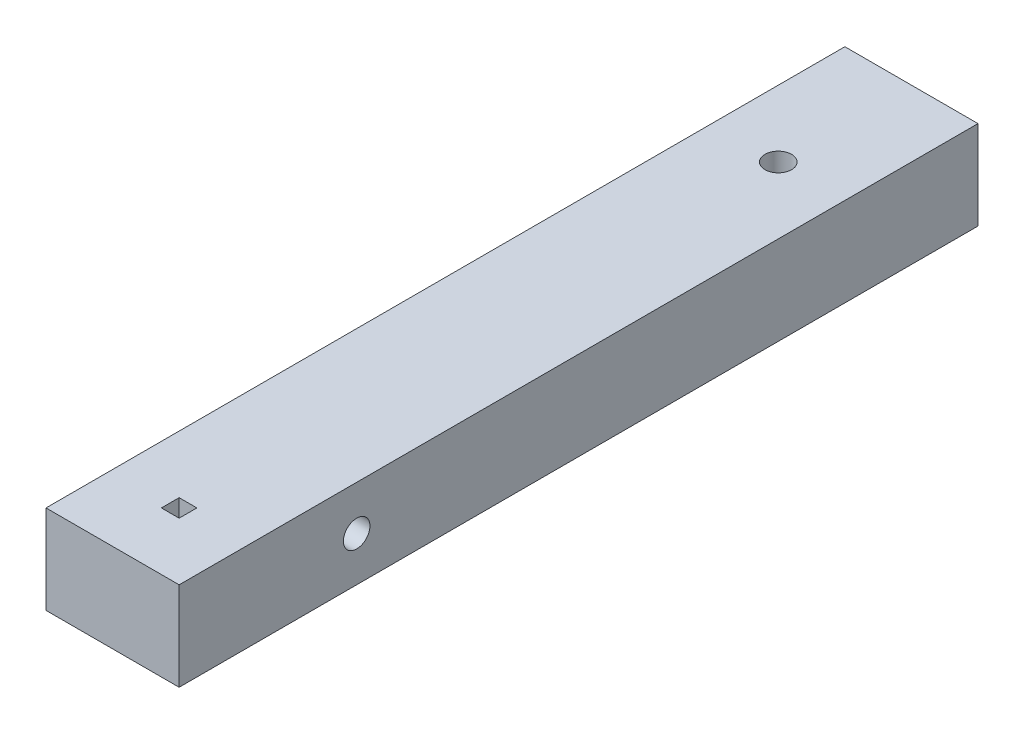
ISO-10303-21;
HEADER;
FILE_DESCRIPTION(('STEP AP214'),'2;1');
FILE_NAME('part.step','',(''),(''),'','','');
FILE_SCHEMA(('AUTOMOTIVE_DESIGN { 1 0 10303 214 1 1 1 1 }'));
ENDSEC;
DATA;
#1=APPLICATION_CONTEXT('core data for automotive mechanical design processes');
#2=APPLICATION_PROTOCOL_DEFINITION('international standard','automotive_design',2000,#1);
#3=PRODUCT_CONTEXT('',#1,'mechanical');
#4=PRODUCT('Part','Part','',(#3));
#5=PRODUCT_RELATED_PRODUCT_CATEGORY('part','',(#4));
#6=PRODUCT_DEFINITION_FORMATION('','',#4);
#7=PRODUCT_DEFINITION_CONTEXT('part definition',#1,'design');
#8=PRODUCT_DEFINITION('design','',#6,#7);
#9=PRODUCT_DEFINITION_SHAPE('','',#8);
#10=(LENGTH_UNIT() NAMED_UNIT(*) SI_UNIT(.MILLI.,.METRE.));
#11=(NAMED_UNIT(*) PLANE_ANGLE_UNIT() SI_UNIT($,.RADIAN.));
#12=(NAMED_UNIT(*) SI_UNIT($,.STERADIAN.) SOLID_ANGLE_UNIT());
#13=UNCERTAINTY_MEASURE_WITH_UNIT(LENGTH_MEASURE(1.E-05),#10,'distance_accuracy_value','');
#14=(GEOMETRIC_REPRESENTATION_CONTEXT(3) GLOBAL_UNCERTAINTY_ASSIGNED_CONTEXT((#13)) GLOBAL_UNIT_ASSIGNED_CONTEXT((#10,
#11,#12)) REPRESENTATION_CONTEXT('',''));
#15=CARTESIAN_POINT('',(0.,0.,0.));
#16=DIRECTION('',(0.,0.,1.));
#17=DIRECTION('',(1.,0.,0.));
#18=AXIS2_PLACEMENT_3D('',#15,#16,#17);
#19=CARTESIAN_POINT('',(-7.5,10.,45.));
#20=DIRECTION('',(1.,0.,0.));
#21=DIRECTION('',(0.,0.,-1.));
#22=AXIS2_PLACEMENT_3D('',#19,#20,#21);
#23=PLANE('',#22);
#24=CARTESIAN_POINT('',(-7.5,5.,25.));
#25=DIRECTION('',(1.,0.,0.));
#26=DIRECTION('',(0.,0.,-1.));
#27=AXIS2_PLACEMENT_3D('',#24,#25,#26);
#28=CIRCLE('',#27,1.5);
#29=CARTESIAN_POINT('',(-7.5,5.,23.5));
#30=VERTEX_POINT('',#29);
#31=EDGE_CURVE('E186',#30,#30,#28,.T.);
#32=ORIENTED_EDGE('',*,*,#31,.T.);
#33=EDGE_LOOP('',(#32));
#34=FACE_BOUND('',#33,.T.);
#35=DIRECTION('',(0.,0.,1.));
#36=VECTOR('',#35,1.);
#37=CARTESIAN_POINT('',(-7.5,0.,45.));
#38=LINE('',#37,#36);
#39=CARTESIAN_POINT('',(-7.5,0.,-45.));
#40=VERTEX_POINT('',#39);
#41=CARTESIAN_POINT('',(-7.5,0.,45.));
#42=VERTEX_POINT('',#41);
#43=EDGE_CURVE('E189',#40,#42,#38,.T.);
#44=ORIENTED_EDGE('',*,*,#43,.T.);
#45=DIRECTION('',(0.,-1.,0.));
#46=VECTOR('',#45,1.);
#47=CARTESIAN_POINT('',(-7.5,10.,45.));
#48=LINE('',#47,#46);
#49=CARTESIAN_POINT('',(-7.5,10.,45.));
#50=VERTEX_POINT('',#49);
#51=EDGE_CURVE('E218',#50,#42,#48,.T.);
#52=ORIENTED_EDGE('',*,*,#51,.F.);
#53=DIRECTION('',(0.,0.,1.));
#54=VECTOR('',#53,1.);
#55=CARTESIAN_POINT('',(-7.5,10.,45.));
#56=LINE('',#55,#54);
#57=CARTESIAN_POINT('',(-7.5,10.,-45.));
#58=VERTEX_POINT('',#57);
#59=EDGE_CURVE('E192',#58,#50,#56,.T.);
#60=ORIENTED_EDGE('',*,*,#59,.F.);
#61=DIRECTION('',(0.,-1.,0.));
#62=VECTOR('',#61,1.);
#63=CARTESIAN_POINT('',(-7.5,10.,-45.));
#64=LINE('',#63,#62);
#65=EDGE_CURVE('E202',#58,#40,#64,.T.);
#66=ORIENTED_EDGE('',*,*,#65,.T.);
#67=EDGE_LOOP('',(#44,#52,#60,#66));
#68=FACE_BOUND('',#67,.T.);
#69=ADVANCED_FACE('F31',(#34,#68),#23,.F.);
#70=CARTESIAN_POINT('',(7.5,10.,45.));
#71=DIRECTION('',(0.,0.,-1.));
#72=DIRECTION('',(-1.,0.,0.));
#73=AXIS2_PLACEMENT_3D('',#70,#71,#72);
#74=PLANE('',#73);
#75=DIRECTION('',(1.,0.,0.));
#76=VECTOR('',#75,1.);
#77=CARTESIAN_POINT('',(7.5,0.,45.));
#78=LINE('',#77,#76);
#79=CARTESIAN_POINT('',(7.5,0.,45.));
#80=VERTEX_POINT('',#79);
#81=EDGE_CURVE('E205',#42,#80,#78,.T.);
#82=ORIENTED_EDGE('',*,*,#81,.T.);
#83=DIRECTION('',(0.,-1.,0.));
#84=VECTOR('',#83,1.);
#85=CARTESIAN_POINT('',(7.5,10.,45.));
#86=LINE('',#85,#84);
#87=CARTESIAN_POINT('',(7.5,10.,45.));
#88=VERTEX_POINT('',#87);
#89=EDGE_CURVE('E215',#88,#80,#86,.T.);
#90=ORIENTED_EDGE('',*,*,#89,.F.);
#91=DIRECTION('',(1.,0.,0.));
#92=VECTOR('',#91,1.);
#93=CARTESIAN_POINT('',(7.5,10.,45.));
#94=LINE('',#93,#92);
#95=EDGE_CURVE('E195',#50,#88,#94,.T.);
#96=ORIENTED_EDGE('',*,*,#95,.F.);
#97=ORIENTED_EDGE('',*,*,#51,.T.);
#98=EDGE_LOOP('',(#82,#90,#96,#97));
#99=FACE_BOUND('',#98,.T.);
#100=ADVANCED_FACE('F242',(#99),#74,.F.);
#101=CARTESIAN_POINT('',(7.5,10.,45.));
#102=DIRECTION('',(-1.,0.,0.));
#103=DIRECTION('',(0.,0.,1.));
#104=AXIS2_PLACEMENT_3D('',#101,#102,#103);
#105=PLANE('',#104);
#106=CARTESIAN_POINT('',(7.5,5.,25.));
#107=DIRECTION('',(1.,0.,0.));
#108=DIRECTION('',(0.,0.,-1.));
#109=AXIS2_PLACEMENT_3D('',#106,#107,#108);
#110=CIRCLE('',#109,1.5);
#111=CARTESIAN_POINT('',(7.5,5.,23.5));
#112=VERTEX_POINT('',#111);
#113=EDGE_CURVE('E179',#112,#112,#110,.T.);
#114=ORIENTED_EDGE('',*,*,#113,.F.);
#115=EDGE_LOOP('',(#114));
#116=FACE_BOUND('',#115,.T.);
#117=DIRECTION('',(0.,0.,-1.));
#118=VECTOR('',#117,1.);
#119=CARTESIAN_POINT('',(7.5,0.,45.));
#120=LINE('',#119,#118);
#121=CARTESIAN_POINT('',(7.5,0.,-45.));
#122=VERTEX_POINT('',#121);
#123=EDGE_CURVE('E207',#80,#122,#120,.T.);
#124=ORIENTED_EDGE('',*,*,#123,.T.);
#125=DIRECTION('',(0.,-1.,0.));
#126=VECTOR('',#125,1.);
#127=CARTESIAN_POINT('',(7.5,10.,-45.));
#128=LINE('',#127,#126);
#129=CARTESIAN_POINT('',(7.5,10.,-45.));
#130=VERTEX_POINT('',#129);
#131=EDGE_CURVE('E212',#130,#122,#128,.T.);
#132=ORIENTED_EDGE('',*,*,#131,.F.);
#133=DIRECTION('',(0.,0.,-1.));
#134=VECTOR('',#133,1.);
#135=CARTESIAN_POINT('',(7.5,10.,45.));
#136=LINE('',#135,#134);
#137=EDGE_CURVE('E198',#88,#130,#136,.T.);
#138=ORIENTED_EDGE('',*,*,#137,.F.);
#139=ORIENTED_EDGE('',*,*,#89,.T.);
#140=EDGE_LOOP('',(#124,#132,#138,#139));
#141=FACE_BOUND('',#140,.T.);
#142=ADVANCED_FACE('F247',(#116,#141),#105,.F.);
#143=CARTESIAN_POINT('',(7.5,10.,-45.));
#144=DIRECTION('',(0.,0.,1.));
#145=DIRECTION('',(1.,0.,0.));
#146=AXIS2_PLACEMENT_3D('',#143,#144,#145);
#147=PLANE('',#146);
#148=DIRECTION('',(-1.,0.,0.));
#149=VECTOR('',#148,1.);
#150=CARTESIAN_POINT('',(-1.,4.,-45.));
#151=LINE('',#150,#149);
#152=CARTESIAN_POINT('',(1.,4.,-45.));
#153=VERTEX_POINT('',#152);
#154=CARTESIAN_POINT('',(-1.,4.,-45.));
#155=VERTEX_POINT('',#154);
#156=EDGE_CURVE('E131',#153,#155,#151,.T.);
#157=ORIENTED_EDGE('',*,*,#156,.F.);
#158=DIRECTION('',(0.,-1.,0.));
#159=VECTOR('',#158,1.);
#160=CARTESIAN_POINT('',(1.,4.,-45.));
#161=LINE('',#160,#159);
#162=CARTESIAN_POINT('',(1.,6.,-45.));
#163=VERTEX_POINT('',#162);
#164=EDGE_CURVE('E45',#163,#153,#161,.T.);
#165=ORIENTED_EDGE('',*,*,#164,.F.);
#166=DIRECTION('',(1.,0.,0.));
#167=VECTOR('',#166,1.);
#168=CARTESIAN_POINT('',(-1.,6.,-45.));
#169=LINE('',#168,#167);
#170=CARTESIAN_POINT('',(-1.,6.,-45.));
#171=VERTEX_POINT('',#170);
#172=EDGE_CURVE('E138',#171,#163,#169,.T.);
#173=ORIENTED_EDGE('',*,*,#172,.F.);
#174=DIRECTION('',(0.,1.,0.));
#175=VECTOR('',#174,1.);
#176=CARTESIAN_POINT('',(-1.,4.,-45.));
#177=LINE('',#176,#175);
#178=EDGE_CURVE('E122',#155,#171,#177,.T.);
#179=ORIENTED_EDGE('',*,*,#178,.F.);
#180=EDGE_LOOP('',(#157,#165,#173,#179));
#181=FACE_BOUND('',#180,.T.);
#182=DIRECTION('',(-1.,0.,0.));
#183=VECTOR('',#182,1.);
#184=CARTESIAN_POINT('',(7.5,0.,-45.));
#185=LINE('',#184,#183);
#186=EDGE_CURVE('E196',#122,#40,#185,.T.);
#187=ORIENTED_EDGE('',*,*,#186,.T.);
#188=ORIENTED_EDGE('',*,*,#65,.F.);
#189=DIRECTION('',(-1.,0.,0.));
#190=VECTOR('',#189,1.);
#191=CARTESIAN_POINT('',(7.5,10.,-45.));
#192=LINE('',#191,#190);
#193=EDGE_CURVE('E200',#130,#58,#192,.T.);
#194=ORIENTED_EDGE('',*,*,#193,.F.);
#195=ORIENTED_EDGE('',*,*,#131,.T.);
#196=EDGE_LOOP('',(#187,#188,#194,#195));
#197=FACE_BOUND('',#196,.T.);
#198=ADVANCED_FACE('F135',(#181,#197),#147,.F.);
#199=CARTESIAN_POINT('',(-7.5,10.,-45.));
#200=DIRECTION('',(0.,1.,0.));
#201=DIRECTION('',(0.,0.,1.));
#202=AXIS2_PLACEMENT_3D('',#199,#200,#201);
#203=PLANE('',#202);
#204=CARTESIAN_POINT('',(0.,10.,-30.));
#205=DIRECTION('',(0.,1.,0.));
#206=DIRECTION('',(0.,0.,1.));
#207=AXIS2_PLACEMENT_3D('',#204,#205,#206);
#208=CIRCLE('',#207,1.5);
#209=CARTESIAN_POINT('',(0.,10.,-28.5));
#210=VERTEX_POINT('',#209);
#211=EDGE_CURVE('E145',#210,#210,#208,.T.);
#212=ORIENTED_EDGE('',*,*,#211,.F.);
#213=EDGE_LOOP('',(#212));
#214=FACE_BOUND('',#213,.T.);
#215=DIRECTION('',(0.,0.,-1.));
#216=VECTOR('',#215,1.);
#217=CARTESIAN_POINT('',(-1.,10.,36.5));
#218=LINE('',#217,#216);
#219=CARTESIAN_POINT('',(-1.,10.,38.5));
#220=VERTEX_POINT('',#219);
#221=CARTESIAN_POINT('',(-1.,10.,36.5));
#222=VERTEX_POINT('',#221);
#223=EDGE_CURVE('E154',#220,#222,#218,.T.);
#224=ORIENTED_EDGE('',*,*,#223,.T.);
#225=DIRECTION('',(1.,0.,0.));
#226=VECTOR('',#225,1.);
#227=CARTESIAN_POINT('',(0.999999999999999,10.,36.5));
#228=LINE('',#227,#226);
#229=CARTESIAN_POINT('',(0.999999999999999,10.,36.5));
#230=VERTEX_POINT('',#229);
#231=EDGE_CURVE('E157',#222,#230,#228,.T.);
#232=ORIENTED_EDGE('',*,*,#231,.T.);
#233=DIRECTION('',(0.,0.,1.));
#234=VECTOR('',#233,1.);
#235=CARTESIAN_POINT('',(0.999999999999999,10.,36.5));
#236=LINE('',#235,#234);
#237=CARTESIAN_POINT('',(0.999999999999999,10.,38.5));
#238=VERTEX_POINT('',#237);
#239=EDGE_CURVE('E161',#230,#238,#236,.T.);
#240=ORIENTED_EDGE('',*,*,#239,.T.);
#241=DIRECTION('',(-1.,0.,0.));
#242=VECTOR('',#241,1.);
#243=CARTESIAN_POINT('',(0.999999999999999,10.,38.5));
#244=LINE('',#243,#242);
#245=EDGE_CURVE('E164',#238,#220,#244,.T.);
#246=ORIENTED_EDGE('',*,*,#245,.T.);
#247=EDGE_LOOP('',(#224,#232,#240,#246));
#248=FACE_BOUND('',#247,.T.);
#249=ORIENTED_EDGE('',*,*,#59,.T.);
#250=ORIENTED_EDGE('',*,*,#95,.T.);
#251=ORIENTED_EDGE('',*,*,#137,.T.);
#252=ORIENTED_EDGE('',*,*,#193,.T.);
#253=EDGE_LOOP('',(#249,#250,#251,#252));
#254=FACE_BOUND('',#253,.T.);
#255=ADVANCED_FACE('F262',(#214,#248,#254),#203,.T.);
#256=CARTESIAN_POINT('',(-7.5,0.,-45.));
#257=DIRECTION('',(0.,1.,0.));
#258=DIRECTION('',(0.,0.,1.));
#259=AXIS2_PLACEMENT_3D('',#256,#257,#258);
#260=PLANE('',#259);
#261=CARTESIAN_POINT('',(0.,0.,-30.));
#262=DIRECTION('',(0.,1.,0.));
#263=DIRECTION('',(0.,0.,1.));
#264=AXIS2_PLACEMENT_3D('',#261,#262,#263);
#265=CIRCLE('',#264,1.5);
#266=CARTESIAN_POINT('',(0.,0.,-28.5));
#267=VERTEX_POINT('',#266);
#268=EDGE_CURVE('E148',#267,#267,#265,.T.);
#269=ORIENTED_EDGE('',*,*,#268,.T.);
#270=EDGE_LOOP('',(#269));
#271=FACE_BOUND('',#270,.T.);
#272=DIRECTION('',(1.,0.,0.));
#273=VECTOR('',#272,1.);
#274=CARTESIAN_POINT('',(0.999999999999999,0.,36.5));
#275=LINE('',#274,#273);
#276=CARTESIAN_POINT('',(-1.,0.,36.5));
#277=VERTEX_POINT('',#276);
#278=CARTESIAN_POINT('',(0.999999999999999,0.,36.5));
#279=VERTEX_POINT('',#278);
#280=EDGE_CURVE('E169',#277,#279,#275,.T.);
#281=ORIENTED_EDGE('',*,*,#280,.F.);
#282=DIRECTION('',(0.,0.,-1.));
#283=VECTOR('',#282,1.);
#284=CARTESIAN_POINT('',(-1.,0.,36.5));
#285=LINE('',#284,#283);
#286=CARTESIAN_POINT('',(-1.,0.,38.5));
#287=VERTEX_POINT('',#286);
#288=EDGE_CURVE('E151',#287,#277,#285,.T.);
#289=ORIENTED_EDGE('',*,*,#288,.F.);
#290=DIRECTION('',(-1.,0.,0.));
#291=VECTOR('',#290,1.);
#292=CARTESIAN_POINT('',(0.999999999999999,0.,38.5));
#293=LINE('',#292,#291);
#294=CARTESIAN_POINT('',(0.999999999999999,0.,38.5));
#295=VERTEX_POINT('',#294);
#296=EDGE_CURVE('E158',#295,#287,#293,.T.);
#297=ORIENTED_EDGE('',*,*,#296,.F.);
#298=DIRECTION('',(0.,0.,1.));
#299=VECTOR('',#298,1.);
#300=CARTESIAN_POINT('',(0.999999999999999,0.,36.5));
#301=LINE('',#300,#299);
#302=EDGE_CURVE('E172',#279,#295,#301,.T.);
#303=ORIENTED_EDGE('',*,*,#302,.F.);
#304=EDGE_LOOP('',(#281,#289,#297,#303));
#305=FACE_BOUND('',#304,.T.);
#306=ORIENTED_EDGE('',*,*,#43,.F.);
#307=ORIENTED_EDGE('',*,*,#186,.F.);
#308=ORIENTED_EDGE('',*,*,#123,.F.);
#309=ORIENTED_EDGE('',*,*,#81,.F.);
#310=EDGE_LOOP('',(#306,#307,#308,#309));
#311=FACE_BOUND('',#310,.T.);
#312=ADVANCED_FACE('F257',(#271,#305,#311),#260,.F.);
#313=CARTESIAN_POINT('',(-7.5,5.,25.));
#314=DIRECTION('',(1.,0.,0.));
#315=DIRECTION('',(0.,0.,-1.));
#316=AXIS2_PLACEMENT_3D('',#313,#314,#315);
#317=CYLINDRICAL_SURFACE('',#316,1.5);
#318=ORIENTED_EDGE('',*,*,#31,.F.);
#319=EDGE_LOOP('',(#318));
#320=FACE_BOUND('',#319,.T.);
#321=ORIENTED_EDGE('',*,*,#113,.T.);
#322=EDGE_LOOP('',(#321));
#323=FACE_BOUND('',#322,.T.);
#324=ADVANCED_FACE('F277',(#320,#323),#317,.F.);
#325=CARTESIAN_POINT('',(-1.,10.,36.5));
#326=DIRECTION('',(-1.,0.,0.));
#327=DIRECTION('',(0.,0.,1.));
#328=AXIS2_PLACEMENT_3D('',#325,#326,#327);
#329=PLANE('',#328);
#330=ORIENTED_EDGE('',*,*,#288,.T.);
#331=DIRECTION('',(0.,-1.,0.));
#332=VECTOR('',#331,1.);
#333=CARTESIAN_POINT('',(-1.,10.,36.5));
#334=LINE('',#333,#332);
#335=EDGE_CURVE('E167',#222,#277,#334,.T.);
#336=ORIENTED_EDGE('',*,*,#335,.F.);
#337=ORIENTED_EDGE('',*,*,#223,.F.);
#338=DIRECTION('',(0.,-1.,0.));
#339=VECTOR('',#338,1.);
#340=CARTESIAN_POINT('',(-1.,10.,38.5));
#341=LINE('',#340,#339);
#342=EDGE_CURVE('E177',#220,#287,#341,.T.);
#343=ORIENTED_EDGE('',*,*,#342,.T.);
#344=EDGE_LOOP('',(#330,#336,#337,#343));
#345=FACE_BOUND('',#344,.T.);
#346=ADVANCED_FACE('F284',(#345),#329,.F.);
#347=CARTESIAN_POINT('',(0.999999999999999,10.,38.5));
#348=DIRECTION('',(0.,0.,1.));
#349=DIRECTION('',(1.,0.,0.));
#350=AXIS2_PLACEMENT_3D('',#347,#348,#349);
#351=PLANE('',#350);
#352=ORIENTED_EDGE('',*,*,#296,.T.);
#353=ORIENTED_EDGE('',*,*,#342,.F.);
#354=ORIENTED_EDGE('',*,*,#245,.F.);
#355=DIRECTION('',(0.,-1.,0.));
#356=VECTOR('',#355,1.);
#357=CARTESIAN_POINT('',(0.999999999999999,10.,38.5));
#358=LINE('',#357,#356);
#359=EDGE_CURVE('E180',#238,#295,#358,.T.);
#360=ORIENTED_EDGE('',*,*,#359,.T.);
#361=EDGE_LOOP('',(#352,#353,#354,#360));
#362=FACE_BOUND('',#361,.T.);
#363=ADVANCED_FACE('F288',(#362),#351,.F.);
#364=CARTESIAN_POINT('',(0.999999999999999,10.,36.5));
#365=DIRECTION('',(1.,0.,0.));
#366=DIRECTION('',(0.,0.,-1.));
#367=AXIS2_PLACEMENT_3D('',#364,#365,#366);
#368=PLANE('',#367);
#369=ORIENTED_EDGE('',*,*,#302,.T.);
#370=ORIENTED_EDGE('',*,*,#359,.F.);
#371=ORIENTED_EDGE('',*,*,#239,.F.);
#372=DIRECTION('',(0.,-1.,0.));
#373=VECTOR('',#372,1.);
#374=CARTESIAN_POINT('',(0.999999999999999,10.,36.5));
#375=LINE('',#374,#373);
#376=EDGE_CURVE('E182',#230,#279,#375,.T.);
#377=ORIENTED_EDGE('',*,*,#376,.T.);
#378=EDGE_LOOP('',(#369,#370,#371,#377));
#379=FACE_BOUND('',#378,.T.);
#380=ADVANCED_FACE('F292',(#379),#368,.F.);
#381=CARTESIAN_POINT('',(0.999999999999999,10.,36.5));
#382=DIRECTION('',(0.,0.,-1.));
#383=DIRECTION('',(-1.,0.,0.));
#384=AXIS2_PLACEMENT_3D('',#381,#382,#383);
#385=PLANE('',#384);
#386=ORIENTED_EDGE('',*,*,#280,.T.);
#387=ORIENTED_EDGE('',*,*,#376,.F.);
#388=ORIENTED_EDGE('',*,*,#231,.F.);
#389=ORIENTED_EDGE('',*,*,#335,.T.);
#390=EDGE_LOOP('',(#386,#387,#388,#389));
#391=FACE_BOUND('',#390,.T.);
#392=ADVANCED_FACE('F238',(#391),#385,.F.);
#393=CARTESIAN_POINT('',(0.,0.,-30.));
#394=DIRECTION('',(0.,1.,0.));
#395=DIRECTION('',(0.,0.,1.));
#396=AXIS2_PLACEMENT_3D('',#393,#394,#395);
#397=CYLINDRICAL_SURFACE('',#396,1.5);
#398=CARTESIAN_POINT('',(0.,6.,-30.));
#399=DIRECTION('',(0.,1.,0.));
#400=DIRECTION('',(0.,0.,1.));
#401=AXIS2_PLACEMENT_3D('',#398,#399,#400);
#402=CIRCLE('',#401,1.5);
#403=CARTESIAN_POINT('',(-1.,6.,-31.1180339887499));
#404=VERTEX_POINT('',#403);
#405=CARTESIAN_POINT('',(1.,6.,-31.1180339887499));
#406=VERTEX_POINT('',#405);
#407=EDGE_CURVE('E38',#404,#406,#402,.F.);
#408=ORIENTED_EDGE('',*,*,#407,.T.);
#409=DIRECTION('',(0.,1.,0.));
#410=VECTOR('',#409,1.);
#411=CARTESIAN_POINT('',(1.,0.,-31.1180339887499));
#412=LINE('',#411,#410);
#413=CARTESIAN_POINT('',(1.,4.,-31.1180339887499));
#414=VERTEX_POINT('',#413);
#415=EDGE_CURVE('E11',#406,#414,#412,.F.);
#416=ORIENTED_EDGE('',*,*,#415,.T.);
#417=CARTESIAN_POINT('',(0.,4.,-30.));
#418=DIRECTION('',(0.,-1.,0.));
#419=DIRECTION('',(0.,0.,-1.));
#420=AXIS2_PLACEMENT_3D('',#417,#418,#419);
#421=CIRCLE('',#420,1.5);
#422=CARTESIAN_POINT('',(-1.,4.,-31.1180339887499));
#423=VERTEX_POINT('',#422);
#424=EDGE_CURVE('E221',#414,#423,#421,.F.);
#425=ORIENTED_EDGE('',*,*,#424,.T.);
#426=DIRECTION('',(0.,1.,0.));
#427=VECTOR('',#426,1.);
#428=CARTESIAN_POINT('',(-1.,0.,-31.1180339887499));
#429=LINE('',#428,#427);
#430=EDGE_CURVE('E125',#423,#404,#429,.T.);
#431=ORIENTED_EDGE('',*,*,#430,.T.);
#432=EDGE_LOOP('',(#408,#416,#425,#431));
#433=FACE_BOUND('',#432,.T.);
#434=ORIENTED_EDGE('',*,*,#268,.F.);
#435=EDGE_LOOP('',(#434));
#436=FACE_BOUND('',#435,.T.);
#437=ORIENTED_EDGE('',*,*,#211,.T.);
#438=EDGE_LOOP('',(#437));
#439=FACE_BOUND('',#438,.T.);
#440=ADVANCED_FACE('F225',(#433,#436,#439),#397,.F.);
#441=CARTESIAN_POINT('',(1.,4.,-30.));
#442=DIRECTION('',(1.,0.,0.));
#443=DIRECTION('',(0.,0.,-1.));
#444=AXIS2_PLACEMENT_3D('',#441,#442,#443);
#445=PLANE('',#444);
#446=DIRECTION('',(0.,0.,-1.));
#447=VECTOR('',#446,1.);
#448=CARTESIAN_POINT('',(1.,6.,-30.));
#449=LINE('',#448,#447);
#450=EDGE_CURVE('E143',#406,#163,#449,.T.);
#451=ORIENTED_EDGE('',*,*,#450,.T.);
#452=ORIENTED_EDGE('',*,*,#164,.T.);
#453=DIRECTION('',(0.,0.,-1.));
#454=VECTOR('',#453,1.);
#455=CARTESIAN_POINT('',(1.,4.,-30.));
#456=LINE('',#455,#454);
#457=EDGE_CURVE('E128',#414,#153,#456,.T.);
#458=ORIENTED_EDGE('',*,*,#457,.F.);
#459=ORIENTED_EDGE('',*,*,#415,.F.);
#460=EDGE_LOOP('',(#451,#452,#458,#459));
#461=FACE_BOUND('',#460,.T.);
#462=ADVANCED_FACE('F230',(#461),#445,.F.);
#463=CARTESIAN_POINT('',(-1.,6.,-30.));
#464=DIRECTION('',(0.,1.,0.));
#465=DIRECTION('',(0.,0.,1.));
#466=AXIS2_PLACEMENT_3D('',#463,#464,#465);
#467=PLANE('',#466);
#468=DIRECTION('',(0.,0.,-1.));
#469=VECTOR('',#468,1.);
#470=CARTESIAN_POINT('',(-1.,6.,-30.));
#471=LINE('',#470,#469);
#472=EDGE_CURVE('E127',#404,#171,#471,.T.);
#473=ORIENTED_EDGE('',*,*,#472,.T.);
#474=ORIENTED_EDGE('',*,*,#172,.T.);
#475=ORIENTED_EDGE('',*,*,#450,.F.);
#476=ORIENTED_EDGE('',*,*,#407,.F.);
#477=EDGE_LOOP('',(#473,#474,#475,#476));
#478=FACE_BOUND('',#477,.T.);
#479=ADVANCED_FACE('F229',(#478),#467,.F.);
#480=CARTESIAN_POINT('',(-1.,4.,-30.));
#481=DIRECTION('',(-1.,0.,0.));
#482=DIRECTION('',(0.,0.,1.));
#483=AXIS2_PLACEMENT_3D('',#480,#481,#482);
#484=PLANE('',#483);
#485=DIRECTION('',(0.,0.,-1.));
#486=VECTOR('',#485,1.);
#487=CARTESIAN_POINT('',(-1.,4.,-30.));
#488=LINE('',#487,#486);
#489=EDGE_CURVE('E53',#423,#155,#488,.T.);
#490=ORIENTED_EDGE('',*,*,#489,.T.);
#491=ORIENTED_EDGE('',*,*,#178,.T.);
#492=ORIENTED_EDGE('',*,*,#472,.F.);
#493=ORIENTED_EDGE('',*,*,#430,.F.);
#494=EDGE_LOOP('',(#490,#491,#492,#493));
#495=FACE_BOUND('',#494,.T.);
#496=ADVANCED_FACE('F119',(#495),#484,.F.);
#497=CARTESIAN_POINT('',(-1.,4.,-30.));
#498=DIRECTION('',(0.,-1.,0.));
#499=DIRECTION('',(0.,0.,-1.));
#500=AXIS2_PLACEMENT_3D('',#497,#498,#499);
#501=PLANE('',#500);
#502=ORIENTED_EDGE('',*,*,#457,.T.);
#503=ORIENTED_EDGE('',*,*,#156,.T.);
#504=ORIENTED_EDGE('',*,*,#489,.F.);
#505=ORIENTED_EDGE('',*,*,#424,.F.);
#506=EDGE_LOOP('',(#502,#503,#504,#505));
#507=FACE_BOUND('',#506,.T.);
#508=ADVANCED_FACE('F132',(#507),#501,.F.);
#509=CLOSED_SHELL('',(#69,#100,#142,#198,#255,#312,#324,#346,#363,#380,#392,#440,#462,#479,#496,#508));
#510=MANIFOLD_SOLID_BREP('B2',#509);
#511=ADVANCED_BREP_SHAPE_REPRESENTATION('',(#18,#510),#14);
#512=SHAPE_DEFINITION_REPRESENTATION(#9,#511);
ENDSEC;
END-ISO-10303-21;
